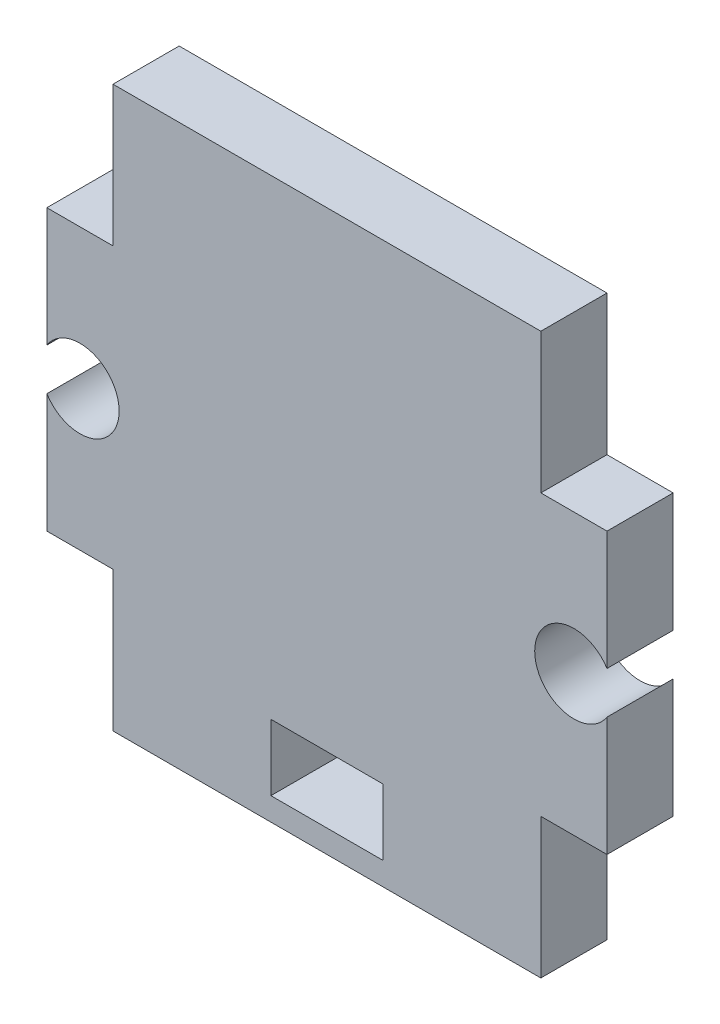
ISO-10303-21;
HEADER;
FILE_DESCRIPTION(('STEP AP214'),'2;1');
FILE_NAME('part.step','',(''),(''),'','','');
FILE_SCHEMA(('AUTOMOTIVE_DESIGN { 1 0 10303 214 1 1 1 1 }'));
ENDSEC;
DATA;
#1=APPLICATION_CONTEXT('core data for automotive mechanical design processes');
#2=APPLICATION_PROTOCOL_DEFINITION('international standard','automotive_design',2000,#1);
#3=PRODUCT_CONTEXT('',#1,'mechanical');
#4=PRODUCT('Part','Part','',(#3));
#5=PRODUCT_RELATED_PRODUCT_CATEGORY('part','',(#4));
#6=PRODUCT_DEFINITION_FORMATION('','',#4);
#7=PRODUCT_DEFINITION_CONTEXT('part definition',#1,'design');
#8=PRODUCT_DEFINITION('design','',#6,#7);
#9=PRODUCT_DEFINITION_SHAPE('','',#8);
#10=(LENGTH_UNIT() NAMED_UNIT(*) SI_UNIT(.MILLI.,.METRE.));
#11=(NAMED_UNIT(*) PLANE_ANGLE_UNIT() SI_UNIT($,.RADIAN.));
#12=(NAMED_UNIT(*) SI_UNIT($,.STERADIAN.) SOLID_ANGLE_UNIT());
#13=UNCERTAINTY_MEASURE_WITH_UNIT(LENGTH_MEASURE(1.E-05),#10,'distance_accuracy_value','');
#14=(GEOMETRIC_REPRESENTATION_CONTEXT(3) GLOBAL_UNCERTAINTY_ASSIGNED_CONTEXT((#13)) GLOBAL_UNIT_ASSIGNED_CONTEXT((#10,
#11,#12)) REPRESENTATION_CONTEXT('',''));
#15=CARTESIAN_POINT('',(0.,0.,0.));
#16=DIRECTION('',(0.,0.,1.));
#17=DIRECTION('',(1.,0.,0.));
#18=AXIS2_PLACEMENT_3D('',#15,#16,#17);
#19=CARTESIAN_POINT('',(12.7,-12.7,3.));
#20=DIRECTION('',(-1.,0.,0.));
#21=DIRECTION('',(0.,0.,1.));
#22=AXIS2_PLACEMENT_3D('',#19,#20,#21);
#23=PLANE('',#22);
#24=DIRECTION('',(0.,1.,0.));
#25=VECTOR('',#24,1.);
#26=CARTESIAN_POINT('',(12.7,-12.7,0.));
#27=LINE('',#26,#25);
#28=CARTESIAN_POINT('',(12.7,-6.35,0.));
#29=VERTEX_POINT('',#28);
#30=CARTESIAN_POINT('',(12.7,-0.954611963050954,0.));
#31=VERTEX_POINT('',#30);
#32=EDGE_CURVE('E311',#29,#31,#27,.T.);
#33=ORIENTED_EDGE('',*,*,#32,.T.);
#34=DIRECTION('',(0.,0.,1.));
#35=VECTOR('',#34,1.);
#36=CARTESIAN_POINT('',(12.7,-0.954611963050954,0.));
#37=LINE('',#36,#35);
#38=CARTESIAN_POINT('',(12.7,-0.954611963050954,3.));
#39=VERTEX_POINT('',#38);
#40=EDGE_CURVE('E212',#31,#39,#37,.T.);
#41=ORIENTED_EDGE('',*,*,#40,.T.);
#42=DIRECTION('',(0.,1.,0.));
#43=VECTOR('',#42,1.);
#44=CARTESIAN_POINT('',(12.7,-12.7,3.));
#45=LINE('',#44,#43);
#46=CARTESIAN_POINT('',(12.7,-6.35,3.));
#47=VERTEX_POINT('',#46);
#48=EDGE_CURVE('E299',#47,#39,#45,.T.);
#49=ORIENTED_EDGE('',*,*,#48,.F.);
#50=DIRECTION('',(0.,0.,1.));
#51=VECTOR('',#50,1.);
#52=CARTESIAN_POINT('',(12.7,-6.35,0.));
#53=LINE('',#52,#51);
#54=EDGE_CURVE('E268',#29,#47,#53,.T.);
#55=ORIENTED_EDGE('',*,*,#54,.F.);
#56=EDGE_LOOP('',(#33,#41,#49,#55));
#57=FACE_BOUND('',#56,.T.);
#58=ADVANCED_FACE('F32',(#57),#23,.F.);
#59=CARTESIAN_POINT('',(-12.7,-12.7,3.));
#60=DIRECTION('',(1.,0.,0.));
#61=DIRECTION('',(0.,0.,-1.));
#62=AXIS2_PLACEMENT_3D('',#59,#60,#61);
#63=PLANE('',#62);
#64=DIRECTION('',(0.,-1.,0.));
#65=VECTOR('',#64,1.);
#66=CARTESIAN_POINT('',(-12.7,-12.7,0.));
#67=LINE('',#66,#65);
#68=CARTESIAN_POINT('',(-12.7,6.35,0.));
#69=VERTEX_POINT('',#68);
#70=CARTESIAN_POINT('',(-12.7,0.954611963050958,0.));
#71=VERTEX_POINT('',#70);
#72=EDGE_CURVE('E318',#69,#71,#67,.T.);
#73=ORIENTED_EDGE('',*,*,#72,.T.);
#74=DIRECTION('',(0.,0.,1.));
#75=VECTOR('',#74,1.);
#76=CARTESIAN_POINT('',(-12.7,0.954611963050958,0.));
#77=LINE('',#76,#75);
#78=CARTESIAN_POINT('',(-12.7,0.954611963050958,3.));
#79=VERTEX_POINT('',#78);
#80=EDGE_CURVE('E220',#71,#79,#77,.T.);
#81=ORIENTED_EDGE('',*,*,#80,.T.);
#82=DIRECTION('',(0.,-1.,0.));
#83=VECTOR('',#82,1.);
#84=CARTESIAN_POINT('',(-12.7,-12.7,3.));
#85=LINE('',#84,#83);
#86=CARTESIAN_POINT('',(-12.7,6.35,3.));
#87=VERTEX_POINT('',#86);
#88=EDGE_CURVE('E307',#87,#79,#85,.T.);
#89=ORIENTED_EDGE('',*,*,#88,.F.);
#90=DIRECTION('',(0.,0.,1.));
#91=VECTOR('',#90,1.);
#92=CARTESIAN_POINT('',(-12.7,6.35,0.));
#93=LINE('',#92,#91);
#94=EDGE_CURVE('E250',#69,#87,#93,.T.);
#95=ORIENTED_EDGE('',*,*,#94,.F.);
#96=EDGE_LOOP('',(#73,#81,#89,#95));
#97=FACE_BOUND('',#96,.T.);
#98=ADVANCED_FACE('F357',(#97),#63,.F.);
#99=CARTESIAN_POINT('',(12.7,0.954611963050954,3.));
#100=VERTEX_POINT('',#99);
#101=CARTESIAN_POINT('',(12.7,6.35,3.));
#102=VERTEX_POINT('',#101);
#103=EDGE_CURVE('E303',#100,#102,#45,.T.);
#104=ORIENTED_EDGE('',*,*,#103,.F.);
#105=DIRECTION('',(0.,0.,1.));
#106=VECTOR('',#105,1.);
#107=CARTESIAN_POINT('',(12.7,0.954611963050954,0.));
#108=LINE('',#107,#106);
#109=CARTESIAN_POINT('',(12.7,0.954611963050954,0.));
#110=VERTEX_POINT('',#109);
#111=EDGE_CURVE('E208',#100,#110,#108,.F.);
#112=ORIENTED_EDGE('',*,*,#111,.T.);
#113=CARTESIAN_POINT('',(12.7,6.35,0.));
#114=VERTEX_POINT('',#113);
#115=EDGE_CURVE('E295',#110,#114,#27,.T.);
#116=ORIENTED_EDGE('',*,*,#115,.T.);
#117=DIRECTION('',(0.,0.,1.));
#118=VECTOR('',#117,1.);
#119=CARTESIAN_POINT('',(12.7,6.35,0.));
#120=LINE('',#119,#118);
#121=EDGE_CURVE('E292',#114,#102,#120,.T.);
#122=ORIENTED_EDGE('',*,*,#121,.T.);
#123=EDGE_LOOP('',(#104,#112,#116,#122));
#124=FACE_BOUND('',#123,.T.);
#125=ADVANCED_FACE('F34',(#124),#23,.F.);
#126=CARTESIAN_POINT('',(-12.7,12.7,3.));
#127=DIRECTION('',(0.,-1.,0.));
#128=DIRECTION('',(0.,0.,-1.));
#129=AXIS2_PLACEMENT_3D('',#126,#127,#128);
#130=PLANE('',#129);
#131=DIRECTION('',(-1.,0.,0.));
#132=VECTOR('',#131,1.);
#133=CARTESIAN_POINT('',(-12.7,12.7,0.));
#134=LINE('',#133,#132);
#135=CARTESIAN_POINT('',(9.7,12.7,0.));
#136=VERTEX_POINT('',#135);
#137=CARTESIAN_POINT('',(-9.7,12.7,0.));
#138=VERTEX_POINT('',#137);
#139=EDGE_CURVE('E314',#136,#138,#134,.T.);
#140=ORIENTED_EDGE('',*,*,#139,.T.);
#141=DIRECTION('',(0.,0.,1.));
#142=VECTOR('',#141,1.);
#143=CARTESIAN_POINT('',(-9.7,12.7,0.));
#144=LINE('',#143,#142);
#145=CARTESIAN_POINT('',(-9.7,12.7,3.));
#146=VERTEX_POINT('',#145);
#147=EDGE_CURVE('E254',#138,#146,#144,.T.);
#148=ORIENTED_EDGE('',*,*,#147,.T.);
#149=DIRECTION('',(-1.,0.,0.));
#150=VECTOR('',#149,1.);
#151=CARTESIAN_POINT('',(-12.7,12.7,3.));
#152=LINE('',#151,#150);
#153=CARTESIAN_POINT('',(9.7,12.7,3.));
#154=VERTEX_POINT('',#153);
#155=EDGE_CURVE('E302',#154,#146,#152,.T.);
#156=ORIENTED_EDGE('',*,*,#155,.F.);
#157=DIRECTION('',(0.,0.,1.));
#158=VECTOR('',#157,1.);
#159=CARTESIAN_POINT('',(9.7,12.7,0.));
#160=LINE('',#159,#158);
#161=EDGE_CURVE('E287',#136,#154,#160,.T.);
#162=ORIENTED_EDGE('',*,*,#161,.F.);
#163=EDGE_LOOP('',(#140,#148,#156,#162));
#164=FACE_BOUND('',#163,.T.);
#165=ADVANCED_FACE('F345',(#164),#130,.F.);
#166=CARTESIAN_POINT('',(-12.7,-0.954611963050965,3.));
#167=VERTEX_POINT('',#166);
#168=CARTESIAN_POINT('',(-12.7,-6.35,3.));
#169=VERTEX_POINT('',#168);
#170=EDGE_CURVE('E306',#167,#169,#85,.T.);
#171=ORIENTED_EDGE('',*,*,#170,.F.);
#172=DIRECTION('',(0.,0.,1.));
#173=VECTOR('',#172,1.);
#174=CARTESIAN_POINT('',(-12.7,-0.954611963050965,0.));
#175=LINE('',#174,#173);
#176=CARTESIAN_POINT('',(-12.7,-0.954611963050965,0.));
#177=VERTEX_POINT('',#176);
#178=EDGE_CURVE('E217',#167,#177,#175,.F.);
#179=ORIENTED_EDGE('',*,*,#178,.T.);
#180=CARTESIAN_POINT('',(-12.7,-6.35,0.));
#181=VERTEX_POINT('',#180);
#182=EDGE_CURVE('E317',#177,#181,#67,.T.);
#183=ORIENTED_EDGE('',*,*,#182,.T.);
#184=DIRECTION('',(0.,0.,1.));
#185=VECTOR('',#184,1.);
#186=CARTESIAN_POINT('',(-12.7,-6.35,0.));
#187=LINE('',#186,#185);
#188=EDGE_CURVE('E236',#181,#169,#187,.T.);
#189=ORIENTED_EDGE('',*,*,#188,.T.);
#190=EDGE_LOOP('',(#171,#179,#183,#189));
#191=FACE_BOUND('',#190,.T.);
#192=ADVANCED_FACE('F363',(#191),#63,.F.);
#193=CARTESIAN_POINT('',(-12.7,-12.7,3.));
#194=DIRECTION('',(0.,1.,0.));
#195=DIRECTION('',(0.,0.,1.));
#196=AXIS2_PLACEMENT_3D('',#193,#194,#195);
#197=PLANE('',#196);
#198=DIRECTION('',(1.,0.,0.));
#199=VECTOR('',#198,1.);
#200=CARTESIAN_POINT('',(-12.7,-12.7,3.));
#201=LINE('',#200,#199);
#202=CARTESIAN_POINT('',(-9.7,-12.7,3.));
#203=VERTEX_POINT('',#202);
#204=CARTESIAN_POINT('',(9.7,-12.7,3.));
#205=VERTEX_POINT('',#204);
#206=EDGE_CURVE('E40',#203,#205,#201,.T.);
#207=ORIENTED_EDGE('',*,*,#206,.F.);
#208=DIRECTION('',(0.,0.,1.));
#209=VECTOR('',#208,1.);
#210=CARTESIAN_POINT('',(-9.7,-12.7,0.));
#211=LINE('',#210,#209);
#212=CARTESIAN_POINT('',(-9.7,-12.7,0.));
#213=VERTEX_POINT('',#212);
#214=EDGE_CURVE('E231',#213,#203,#211,.T.);
#215=ORIENTED_EDGE('',*,*,#214,.F.);
#216=DIRECTION('',(1.,0.,0.));
#217=VECTOR('',#216,1.);
#218=CARTESIAN_POINT('',(-12.7,-12.7,0.));
#219=LINE('',#218,#217);
#220=CARTESIAN_POINT('',(9.7,-12.7,0.));
#221=VERTEX_POINT('',#220);
#222=EDGE_CURVE('E320',#213,#221,#219,.T.);
#223=ORIENTED_EDGE('',*,*,#222,.T.);
#224=DIRECTION('',(0.,0.,1.));
#225=VECTOR('',#224,1.);
#226=CARTESIAN_POINT('',(9.7,-12.7,0.));
#227=LINE('',#226,#225);
#228=EDGE_CURVE('E273',#221,#205,#227,.T.);
#229=ORIENTED_EDGE('',*,*,#228,.T.);
#230=EDGE_LOOP('',(#207,#215,#223,#229));
#231=FACE_BOUND('',#230,.T.);
#232=ADVANCED_FACE('F373',(#231),#197,.F.);
#233=CARTESIAN_POINT('',(0.,0.,3.));
#234=DIRECTION('',(0.,0.,-1.));
#235=DIRECTION('',(-1.,0.,0.));
#236=AXIS2_PLACEMENT_3D('',#233,#234,#235);
#237=PLANE('',#236);
#238=DIRECTION('',(-1.,0.,0.));
#239=VECTOR('',#238,1.);
#240=CARTESIAN_POINT('',(-2.54,-8.66,3.));
#241=LINE('',#240,#239);
#242=CARTESIAN_POINT('',(2.54,-8.66,3.));
#243=VERTEX_POINT('',#242);
#244=CARTESIAN_POINT('',(-2.54,-8.66,3.));
#245=VERTEX_POINT('',#244);
#246=EDGE_CURVE('E195',#243,#245,#241,.T.);
#247=ORIENTED_EDGE('',*,*,#246,.F.);
#248=DIRECTION('',(0.,1.,0.));
#249=VECTOR('',#248,1.);
#250=CARTESIAN_POINT('',(2.54,-11.66,3.));
#251=LINE('',#250,#249);
#252=CARTESIAN_POINT('',(2.54,-11.66,3.));
#253=VERTEX_POINT('',#252);
#254=EDGE_CURVE('E47',#253,#243,#251,.T.);
#255=ORIENTED_EDGE('',*,*,#254,.F.);
#256=DIRECTION('',(1.,0.,0.));
#257=VECTOR('',#256,1.);
#258=CARTESIAN_POINT('',(-2.54,-11.66,3.));
#259=LINE('',#258,#257);
#260=CARTESIAN_POINT('',(-2.54,-11.66,3.));
#261=VERTEX_POINT('',#260);
#262=EDGE_CURVE('E186',#261,#253,#259,.T.);
#263=ORIENTED_EDGE('',*,*,#262,.F.);
#264=DIRECTION('',(0.,-1.,0.));
#265=VECTOR('',#264,1.);
#266=CARTESIAN_POINT('',(-2.54,-11.66,3.));
#267=LINE('',#266,#265);
#268=EDGE_CURVE('E189',#245,#261,#267,.T.);
#269=ORIENTED_EDGE('',*,*,#268,.F.);
#270=EDGE_LOOP('',(#247,#255,#263,#269));
#271=FACE_BOUND('',#270,.T.);
#272=ORIENTED_EDGE('',*,*,#48,.T.);
#273=CARTESIAN_POINT('',(11.2,0.,3.));
#274=DIRECTION('',(0.,0.,1.));
#275=DIRECTION('',(1.,0.,0.));
#276=AXIS2_PLACEMENT_3D('',#273,#274,#275);
#277=CIRCLE('',#276,1.778);
#278=EDGE_CURVE('E201',#100,#39,#277,.T.);
#279=ORIENTED_EDGE('',*,*,#278,.F.);
#280=ORIENTED_EDGE('',*,*,#103,.T.);
#281=DIRECTION('',(1.,0.,0.));
#282=VECTOR('',#281,1.);
#283=CARTESIAN_POINT('',(12.7,6.35,3.));
#284=LINE('',#283,#282);
#285=CARTESIAN_POINT('',(9.7,6.35,3.));
#286=VERTEX_POINT('',#285);
#287=EDGE_CURVE('E284',#286,#102,#284,.T.);
#288=ORIENTED_EDGE('',*,*,#287,.F.);
#289=DIRECTION('',(0.,-1.,0.));
#290=VECTOR('',#289,1.);
#291=CARTESIAN_POINT('',(9.7,12.7,3.));
#292=LINE('',#291,#290);
#293=EDGE_CURVE('E276',#154,#286,#292,.T.);
#294=ORIENTED_EDGE('',*,*,#293,.F.);
#295=ORIENTED_EDGE('',*,*,#155,.T.);
#296=DIRECTION('',(0.,1.,0.));
#297=VECTOR('',#296,1.);
#298=CARTESIAN_POINT('',(-9.7,12.7,3.));
#299=LINE('',#298,#297);
#300=CARTESIAN_POINT('',(-9.7,6.35,3.));
#301=VERTEX_POINT('',#300);
#302=EDGE_CURVE('E247',#301,#146,#299,.T.);
#303=ORIENTED_EDGE('',*,*,#302,.F.);
#304=DIRECTION('',(1.,0.,0.));
#305=VECTOR('',#304,1.);
#306=CARTESIAN_POINT('',(-12.7,6.35,3.));
#307=LINE('',#306,#305);
#308=EDGE_CURVE('E239',#87,#301,#307,.T.);
#309=ORIENTED_EDGE('',*,*,#308,.F.);
#310=ORIENTED_EDGE('',*,*,#88,.T.);
#311=CARTESIAN_POINT('',(-11.2,0.,3.));
#312=DIRECTION('',(0.,0.,1.));
#313=DIRECTION('',(1.,0.,0.));
#314=AXIS2_PLACEMENT_3D('',#311,#312,#313);
#315=CIRCLE('',#314,1.778);
#316=EDGE_CURVE('E215',#167,#79,#315,.T.);
#317=ORIENTED_EDGE('',*,*,#316,.F.);
#318=ORIENTED_EDGE('',*,*,#170,.T.);
#319=DIRECTION('',(-1.,0.,0.));
#320=VECTOR('',#319,1.);
#321=CARTESIAN_POINT('',(-12.7,-6.35,3.));
#322=LINE('',#321,#320);
#323=CARTESIAN_POINT('',(-9.7,-6.35,3.));
#324=VERTEX_POINT('',#323);
#325=EDGE_CURVE('E228',#324,#169,#322,.T.);
#326=ORIENTED_EDGE('',*,*,#325,.F.);
#327=DIRECTION('',(0.,1.,0.));
#328=VECTOR('',#327,1.);
#329=CARTESIAN_POINT('',(-9.7,-12.7,3.));
#330=LINE('',#329,#328);
#331=EDGE_CURVE('E223',#203,#324,#330,.T.);
#332=ORIENTED_EDGE('',*,*,#331,.F.);
#333=ORIENTED_EDGE('',*,*,#206,.T.);
#334=DIRECTION('',(0.,-1.,0.));
#335=VECTOR('',#334,1.);
#336=CARTESIAN_POINT('',(9.7,-12.7,3.));
#337=LINE('',#336,#335);
#338=CARTESIAN_POINT('',(9.7,-6.35,3.));
#339=VERTEX_POINT('',#338);
#340=EDGE_CURVE('E265',#339,#205,#337,.T.);
#341=ORIENTED_EDGE('',*,*,#340,.F.);
#342=DIRECTION('',(-1.,0.,0.));
#343=VECTOR('',#342,1.);
#344=CARTESIAN_POINT('',(12.7,-6.35,3.));
#345=LINE('',#344,#343);
#346=EDGE_CURVE('E257',#47,#339,#345,.T.);
#347=ORIENTED_EDGE('',*,*,#346,.F.);
#348=EDGE_LOOP('',(#272,#279,#280,#288,#294,#295,#303,#309,#310,#317,#318,#326,#332,#333,#341,#347));
#349=FACE_BOUND('',#348,.T.);
#350=ADVANCED_FACE('F329',(#271,#349),#237,.F.);
#351=CARTESIAN_POINT('',(0.,0.,0.));
#352=DIRECTION('',(0.,0.,-1.));
#353=DIRECTION('',(-1.,0.,0.));
#354=AXIS2_PLACEMENT_3D('',#351,#352,#353);
#355=PLANE('',#354);
#356=DIRECTION('',(0.,1.,0.));
#357=VECTOR('',#356,1.);
#358=CARTESIAN_POINT('',(2.54,-11.66,0.));
#359=LINE('',#358,#357);
#360=CARTESIAN_POINT('',(2.54,-11.66,0.));
#361=VERTEX_POINT('',#360);
#362=CARTESIAN_POINT('',(2.54,-8.66,0.));
#363=VERTEX_POINT('',#362);
#364=EDGE_CURVE('E170',#361,#363,#359,.T.);
#365=ORIENTED_EDGE('',*,*,#364,.T.);
#366=DIRECTION('',(-1.,0.,0.));
#367=VECTOR('',#366,1.);
#368=CARTESIAN_POINT('',(-2.54,-8.66,0.));
#369=LINE('',#368,#367);
#370=CARTESIAN_POINT('',(-2.54,-8.66,0.));
#371=VERTEX_POINT('',#370);
#372=EDGE_CURVE('E179',#363,#371,#369,.T.);
#373=ORIENTED_EDGE('',*,*,#372,.T.);
#374=DIRECTION('',(0.,-1.,0.));
#375=VECTOR('',#374,1.);
#376=CARTESIAN_POINT('',(-2.54,-11.66,0.));
#377=LINE('',#376,#375);
#378=CARTESIAN_POINT('',(-2.54,-11.66,0.));
#379=VERTEX_POINT('',#378);
#380=EDGE_CURVE('E55',#371,#379,#377,.T.);
#381=ORIENTED_EDGE('',*,*,#380,.T.);
#382=DIRECTION('',(1.,0.,0.));
#383=VECTOR('',#382,1.);
#384=CARTESIAN_POINT('',(-2.54,-11.66,0.));
#385=LINE('',#384,#383);
#386=EDGE_CURVE('E176',#379,#361,#385,.T.);
#387=ORIENTED_EDGE('',*,*,#386,.T.);
#388=EDGE_LOOP('',(#365,#373,#381,#387));
#389=FACE_BOUND('',#388,.T.);
#390=CARTESIAN_POINT('',(11.2,0.,0.));
#391=DIRECTION('',(0.,0.,1.));
#392=DIRECTION('',(1.,0.,0.));
#393=AXIS2_PLACEMENT_3D('',#390,#391,#392);
#394=CIRCLE('',#393,1.778);
#395=EDGE_CURVE('E205',#110,#31,#394,.T.);
#396=ORIENTED_EDGE('',*,*,#395,.T.);
#397=ORIENTED_EDGE('',*,*,#32,.F.);
#398=DIRECTION('',(-1.,0.,0.));
#399=VECTOR('',#398,1.);
#400=CARTESIAN_POINT('',(12.7,-6.35,0.));
#401=LINE('',#400,#399);
#402=CARTESIAN_POINT('',(9.7,-6.35,0.));
#403=VERTEX_POINT('',#402);
#404=EDGE_CURVE('E261',#29,#403,#401,.T.);
#405=ORIENTED_EDGE('',*,*,#404,.T.);
#406=DIRECTION('',(0.,-1.,0.));
#407=VECTOR('',#406,1.);
#408=CARTESIAN_POINT('',(9.7,-12.7,0.));
#409=LINE('',#408,#407);
#410=EDGE_CURVE('E264',#403,#221,#409,.T.);
#411=ORIENTED_EDGE('',*,*,#410,.T.);
#412=ORIENTED_EDGE('',*,*,#222,.F.);
#413=DIRECTION('',(0.,1.,0.));
#414=VECTOR('',#413,1.);
#415=CARTESIAN_POINT('',(-9.7,-12.7,0.));
#416=LINE('',#415,#414);
#417=CARTESIAN_POINT('',(-9.7,-6.35,0.));
#418=VERTEX_POINT('',#417);
#419=EDGE_CURVE('E224',#213,#418,#416,.T.);
#420=ORIENTED_EDGE('',*,*,#419,.T.);
#421=DIRECTION('',(-1.,0.,0.));
#422=VECTOR('',#421,1.);
#423=CARTESIAN_POINT('',(-12.7,-6.35,0.));
#424=LINE('',#423,#422);
#425=EDGE_CURVE('E227',#418,#181,#424,.T.);
#426=ORIENTED_EDGE('',*,*,#425,.T.);
#427=ORIENTED_EDGE('',*,*,#182,.F.);
#428=CARTESIAN_POINT('',(-11.2,0.,0.));
#429=DIRECTION('',(0.,0.,-1.));
#430=DIRECTION('',(-1.,0.,0.));
#431=AXIS2_PLACEMENT_3D('',#428,#429,#430);
#432=CIRCLE('',#431,1.778);
#433=EDGE_CURVE('E11',#71,#177,#432,.T.);
#434=ORIENTED_EDGE('',*,*,#433,.F.);
#435=ORIENTED_EDGE('',*,*,#72,.F.);
#436=DIRECTION('',(1.,0.,0.));
#437=VECTOR('',#436,1.);
#438=CARTESIAN_POINT('',(-12.7,6.35,0.));
#439=LINE('',#438,#437);
#440=CARTESIAN_POINT('',(-9.7,6.35,0.));
#441=VERTEX_POINT('',#440);
#442=EDGE_CURVE('E243',#69,#441,#439,.T.);
#443=ORIENTED_EDGE('',*,*,#442,.T.);
#444=DIRECTION('',(0.,1.,0.));
#445=VECTOR('',#444,1.);
#446=CARTESIAN_POINT('',(-9.7,12.7,0.));
#447=LINE('',#446,#445);
#448=EDGE_CURVE('E246',#441,#138,#447,.T.);
#449=ORIENTED_EDGE('',*,*,#448,.T.);
#450=ORIENTED_EDGE('',*,*,#139,.F.);
#451=DIRECTION('',(0.,-1.,0.));
#452=VECTOR('',#451,1.);
#453=CARTESIAN_POINT('',(9.7,12.7,0.));
#454=LINE('',#453,#452);
#455=CARTESIAN_POINT('',(9.7,6.35,0.));
#456=VERTEX_POINT('',#455);
#457=EDGE_CURVE('E280',#136,#456,#454,.T.);
#458=ORIENTED_EDGE('',*,*,#457,.T.);
#459=DIRECTION('',(1.,0.,0.));
#460=VECTOR('',#459,1.);
#461=CARTESIAN_POINT('',(12.7,6.35,0.));
#462=LINE('',#461,#460);
#463=EDGE_CURVE('E283',#456,#114,#462,.T.);
#464=ORIENTED_EDGE('',*,*,#463,.T.);
#465=ORIENTED_EDGE('',*,*,#115,.F.);
#466=EDGE_LOOP('',(#396,#397,#405,#411,#412,#420,#426,#427,#434,#435,#443,#449,#450,#458,#464,#465));
#467=FACE_BOUND('',#466,.T.);
#468=ADVANCED_FACE('F183',(#389,#467),#355,.T.);
#469=CARTESIAN_POINT('',(12.7,6.35,0.));
#470=DIRECTION('',(0.,-1.,0.));
#471=DIRECTION('',(0.,0.,-1.));
#472=AXIS2_PLACEMENT_3D('',#469,#470,#471);
#473=PLANE('',#472);
#474=ORIENTED_EDGE('',*,*,#287,.T.);
#475=ORIENTED_EDGE('',*,*,#121,.F.);
#476=ORIENTED_EDGE('',*,*,#463,.F.);
#477=DIRECTION('',(0.,0.,1.));
#478=VECTOR('',#477,1.);
#479=CARTESIAN_POINT('',(9.7,6.35,0.));
#480=LINE('',#479,#478);
#481=EDGE_CURVE('E296',#456,#286,#480,.T.);
#482=ORIENTED_EDGE('',*,*,#481,.T.);
#483=EDGE_LOOP('',(#474,#475,#476,#482));
#484=FACE_BOUND('',#483,.T.);
#485=ADVANCED_FACE('F334',(#484),#473,.F.);
#486=CARTESIAN_POINT('',(9.7,12.7,0.));
#487=DIRECTION('',(-1.,0.,0.));
#488=DIRECTION('',(0.,0.,1.));
#489=AXIS2_PLACEMENT_3D('',#486,#487,#488);
#490=PLANE('',#489);
#491=ORIENTED_EDGE('',*,*,#293,.T.);
#492=ORIENTED_EDGE('',*,*,#481,.F.);
#493=ORIENTED_EDGE('',*,*,#457,.F.);
#494=ORIENTED_EDGE('',*,*,#161,.T.);
#495=EDGE_LOOP('',(#491,#492,#493,#494));
#496=FACE_BOUND('',#495,.T.);
#497=ADVANCED_FACE('F340',(#496),#490,.F.);
#498=CARTESIAN_POINT('',(9.7,-12.7,0.));
#499=DIRECTION('',(-1.,0.,0.));
#500=DIRECTION('',(0.,0.,1.));
#501=AXIS2_PLACEMENT_3D('',#498,#499,#500);
#502=PLANE('',#501);
#503=ORIENTED_EDGE('',*,*,#340,.T.);
#504=ORIENTED_EDGE('',*,*,#228,.F.);
#505=ORIENTED_EDGE('',*,*,#410,.F.);
#506=DIRECTION('',(0.,0.,1.));
#507=VECTOR('',#506,1.);
#508=CARTESIAN_POINT('',(9.7,-6.35,0.));
#509=LINE('',#508,#507);
#510=EDGE_CURVE('E277',#403,#339,#509,.T.);
#511=ORIENTED_EDGE('',*,*,#510,.T.);
#512=EDGE_LOOP('',(#503,#504,#505,#511));
#513=FACE_BOUND('',#512,.T.);
#514=ADVANCED_FACE('F377',(#513),#502,.F.);
#515=CARTESIAN_POINT('',(12.7,-6.35,0.));
#516=DIRECTION('',(0.,1.,0.));
#517=DIRECTION('',(0.,0.,1.));
#518=AXIS2_PLACEMENT_3D('',#515,#516,#517);
#519=PLANE('',#518);
#520=ORIENTED_EDGE('',*,*,#346,.T.);
#521=ORIENTED_EDGE('',*,*,#510,.F.);
#522=ORIENTED_EDGE('',*,*,#404,.F.);
#523=ORIENTED_EDGE('',*,*,#54,.T.);
#524=EDGE_LOOP('',(#520,#521,#522,#523));
#525=FACE_BOUND('',#524,.T.);
#526=ADVANCED_FACE('F380',(#525),#519,.F.);
#527=CARTESIAN_POINT('',(-9.7,12.7,0.));
#528=DIRECTION('',(1.,0.,0.));
#529=DIRECTION('',(0.,0.,-1.));
#530=AXIS2_PLACEMENT_3D('',#527,#528,#529);
#531=PLANE('',#530);
#532=ORIENTED_EDGE('',*,*,#302,.T.);
#533=ORIENTED_EDGE('',*,*,#147,.F.);
#534=ORIENTED_EDGE('',*,*,#448,.F.);
#535=DIRECTION('',(0.,0.,1.));
#536=VECTOR('',#535,1.);
#537=CARTESIAN_POINT('',(-9.7,6.35,0.));
#538=LINE('',#537,#536);
#539=EDGE_CURVE('E258',#441,#301,#538,.T.);
#540=ORIENTED_EDGE('',*,*,#539,.T.);
#541=EDGE_LOOP('',(#532,#533,#534,#540));
#542=FACE_BOUND('',#541,.T.);
#543=ADVANCED_FACE('F347',(#542),#531,.F.);
#544=CARTESIAN_POINT('',(-12.7,6.35,0.));
#545=DIRECTION('',(0.,-1.,0.));
#546=DIRECTION('',(0.,0.,-1.));
#547=AXIS2_PLACEMENT_3D('',#544,#545,#546);
#548=PLANE('',#547);
#549=ORIENTED_EDGE('',*,*,#308,.T.);
#550=ORIENTED_EDGE('',*,*,#539,.F.);
#551=ORIENTED_EDGE('',*,*,#442,.F.);
#552=ORIENTED_EDGE('',*,*,#94,.T.);
#553=EDGE_LOOP('',(#549,#550,#551,#552));
#554=FACE_BOUND('',#553,.T.);
#555=ADVANCED_FACE('F353',(#554),#548,.F.);
#556=CARTESIAN_POINT('',(-12.7,-6.35,0.));
#557=DIRECTION('',(0.,1.,0.));
#558=DIRECTION('',(0.,0.,1.));
#559=AXIS2_PLACEMENT_3D('',#556,#557,#558);
#560=PLANE('',#559);
#561=ORIENTED_EDGE('',*,*,#325,.T.);
#562=ORIENTED_EDGE('',*,*,#188,.F.);
#563=ORIENTED_EDGE('',*,*,#425,.F.);
#564=DIRECTION('',(0.,0.,1.));
#565=VECTOR('',#564,1.);
#566=CARTESIAN_POINT('',(-9.7,-6.35,0.));
#567=LINE('',#566,#565);
#568=EDGE_CURVE('E240',#418,#324,#567,.T.);
#569=ORIENTED_EDGE('',*,*,#568,.T.);
#570=EDGE_LOOP('',(#561,#562,#563,#569));
#571=FACE_BOUND('',#570,.T.);
#572=ADVANCED_FACE('F367',(#571),#560,.F.);
#573=CARTESIAN_POINT('',(-9.7,-12.7,0.));
#574=DIRECTION('',(1.,0.,0.));
#575=DIRECTION('',(0.,0.,-1.));
#576=AXIS2_PLACEMENT_3D('',#573,#574,#575);
#577=PLANE('',#576);
#578=ORIENTED_EDGE('',*,*,#331,.T.);
#579=ORIENTED_EDGE('',*,*,#568,.F.);
#580=ORIENTED_EDGE('',*,*,#419,.F.);
#581=ORIENTED_EDGE('',*,*,#214,.T.);
#582=EDGE_LOOP('',(#578,#579,#580,#581));
#583=FACE_BOUND('',#582,.T.);
#584=ADVANCED_FACE('F370',(#583),#577,.F.);
#585=CARTESIAN_POINT('',(-11.2,0.,0.));
#586=DIRECTION('',(0.,0.,1.));
#587=DIRECTION('',(1.,0.,0.));
#588=AXIS2_PLACEMENT_3D('',#585,#586,#587);
#589=CYLINDRICAL_SURFACE('',#588,1.778);
#590=ORIENTED_EDGE('',*,*,#433,.T.);
#591=ORIENTED_EDGE('',*,*,#178,.F.);
#592=ORIENTED_EDGE('',*,*,#316,.T.);
#593=ORIENTED_EDGE('',*,*,#80,.F.);
#594=EDGE_LOOP('',(#590,#591,#592,#593));
#595=FACE_BOUND('',#594,.T.);
#596=ADVANCED_FACE('F387',(#595),#589,.F.);
#597=CARTESIAN_POINT('',(11.2,0.,0.));
#598=DIRECTION('',(0.,0.,1.));
#599=DIRECTION('',(1.,0.,0.));
#600=AXIS2_PLACEMENT_3D('',#597,#598,#599);
#601=CYLINDRICAL_SURFACE('',#600,1.778);
#602=ORIENTED_EDGE('',*,*,#395,.F.);
#603=ORIENTED_EDGE('',*,*,#111,.F.);
#604=ORIENTED_EDGE('',*,*,#278,.T.);
#605=ORIENTED_EDGE('',*,*,#40,.F.);
#606=EDGE_LOOP('',(#602,#603,#604,#605));
#607=FACE_BOUND('',#606,.T.);
#608=ADVANCED_FACE('F385',(#607),#601,.F.);
#609=CARTESIAN_POINT('',(2.54,-11.66,0.));
#610=DIRECTION('',(1.,0.,0.));
#611=DIRECTION('',(0.,0.,-1.));
#612=AXIS2_PLACEMENT_3D('',#609,#610,#611);
#613=PLANE('',#612);
#614=ORIENTED_EDGE('',*,*,#254,.T.);
#615=DIRECTION('',(0.,0.,1.));
#616=VECTOR('',#615,1.);
#617=CARTESIAN_POINT('',(2.54,-8.66,0.));
#618=LINE('',#617,#616);
#619=EDGE_CURVE('E166',#363,#243,#618,.T.);
#620=ORIENTED_EDGE('',*,*,#619,.F.);
#621=ORIENTED_EDGE('',*,*,#364,.F.);
#622=DIRECTION('',(0.,0.,1.));
#623=VECTOR('',#622,1.);
#624=CARTESIAN_POINT('',(2.54,-11.66,0.));
#625=LINE('',#624,#623);
#626=EDGE_CURVE('E199',#361,#253,#625,.T.);
#627=ORIENTED_EDGE('',*,*,#626,.T.);
#628=EDGE_LOOP('',(#614,#620,#621,#627));
#629=FACE_BOUND('',#628,.T.);
#630=ADVANCED_FACE('F168',(#629),#613,.F.);
#631=CARTESIAN_POINT('',(-2.54,-11.66,0.));
#632=DIRECTION('',(0.,-1.,0.));
#633=DIRECTION('',(0.,0.,-1.));
#634=AXIS2_PLACEMENT_3D('',#631,#632,#633);
#635=PLANE('',#634);
#636=ORIENTED_EDGE('',*,*,#262,.T.);
#637=ORIENTED_EDGE('',*,*,#626,.F.);
#638=ORIENTED_EDGE('',*,*,#386,.F.);
#639=DIRECTION('',(0.,0.,1.));
#640=VECTOR('',#639,1.);
#641=CARTESIAN_POINT('',(-2.54,-11.66,0.));
#642=LINE('',#641,#640);
#643=EDGE_CURVE('E202',#379,#261,#642,.T.);
#644=ORIENTED_EDGE('',*,*,#643,.T.);
#645=EDGE_LOOP('',(#636,#637,#638,#644));
#646=FACE_BOUND('',#645,.T.);
#647=ADVANCED_FACE('F393',(#646),#635,.F.);
#648=CARTESIAN_POINT('',(-2.54,-11.66,0.));
#649=DIRECTION('',(-1.,0.,0.));
#650=DIRECTION('',(0.,0.,1.));
#651=AXIS2_PLACEMENT_3D('',#648,#649,#650);
#652=PLANE('',#651);
#653=ORIENTED_EDGE('',*,*,#268,.T.);
#654=ORIENTED_EDGE('',*,*,#643,.F.);
#655=ORIENTED_EDGE('',*,*,#380,.F.);
#656=DIRECTION('',(0.,0.,1.));
#657=VECTOR('',#656,1.);
#658=CARTESIAN_POINT('',(-2.54,-8.66,0.));
#659=LINE('',#658,#657);
#660=EDGE_CURVE('E175',#371,#245,#659,.T.);
#661=ORIENTED_EDGE('',*,*,#660,.T.);
#662=EDGE_LOOP('',(#653,#654,#655,#661));
#663=FACE_BOUND('',#662,.T.);
#664=ADVANCED_FACE('F462',(#663),#652,.F.);
#665=CARTESIAN_POINT('',(-2.54,-8.66,0.));
#666=DIRECTION('',(0.,1.,0.));
#667=DIRECTION('',(0.,0.,1.));
#668=AXIS2_PLACEMENT_3D('',#665,#666,#667);
#669=PLANE('',#668);
#670=ORIENTED_EDGE('',*,*,#246,.T.);
#671=ORIENTED_EDGE('',*,*,#660,.F.);
#672=ORIENTED_EDGE('',*,*,#372,.F.);
#673=ORIENTED_EDGE('',*,*,#619,.T.);
#674=EDGE_LOOP('',(#670,#671,#672,#673));
#675=FACE_BOUND('',#674,.T.);
#676=ADVANCED_FACE('F180',(#675),#669,.F.);
#677=CLOSED_SHELL('',(#58,#98,#125,#165,#192,#232,#350,#468,#485,#497,#514,#526,#543,#555,#572,
#584,#596,#608,#630,#647,#664,#676));
#678=MANIFOLD_SOLID_BREP('B2',#677);
#679=ADVANCED_BREP_SHAPE_REPRESENTATION('',(#18,#678),#14);
#680=SHAPE_DEFINITION_REPRESENTATION(#9,#679);
ENDSEC;
END-ISO-10303-21;
